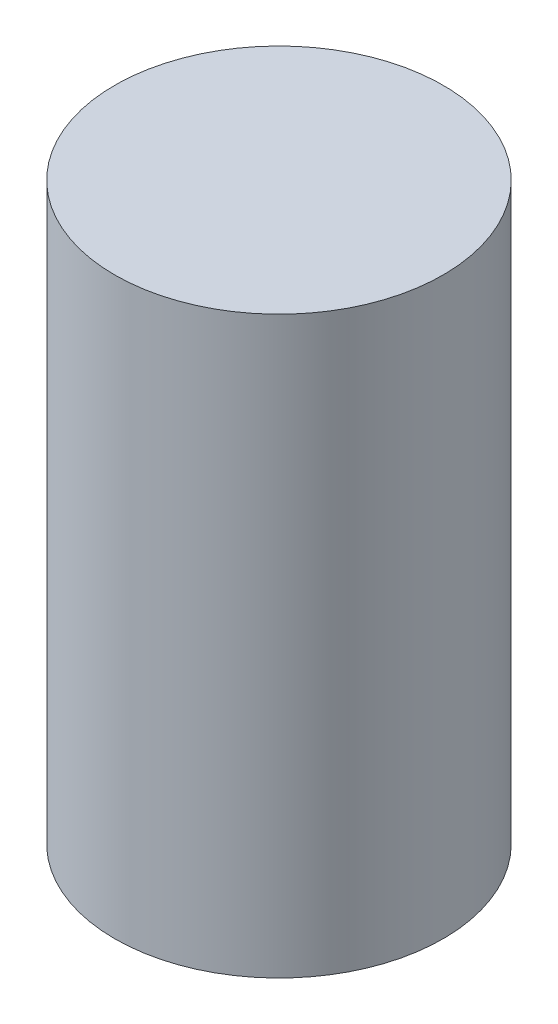
ISO-10303-21;
HEADER;
FILE_DESCRIPTION(('STEP AP214'),'2;1');
FILE_NAME('part.step','',(''),(''),'','','');
FILE_SCHEMA(('AUTOMOTIVE_DESIGN { 1 0 10303 214 1 1 1 1 }'));
ENDSEC;
DATA;
#1=APPLICATION_CONTEXT('core data for automotive mechanical design processes');
#2=APPLICATION_PROTOCOL_DEFINITION('international standard','automotive_design',2000,#1);
#3=PRODUCT_CONTEXT('',#1,'mechanical');
#4=PRODUCT('Part','Part','',(#3));
#5=PRODUCT_RELATED_PRODUCT_CATEGORY('part','',(#4));
#6=PRODUCT_DEFINITION_FORMATION('','',#4);
#7=PRODUCT_DEFINITION_CONTEXT('part definition',#1,'design');
#8=PRODUCT_DEFINITION('design','',#6,#7);
#9=PRODUCT_DEFINITION_SHAPE('','',#8);
#10=(LENGTH_UNIT() NAMED_UNIT(*) SI_UNIT(.MILLI.,.METRE.));
#11=(NAMED_UNIT(*) PLANE_ANGLE_UNIT() SI_UNIT($,.RADIAN.));
#12=(NAMED_UNIT(*) SI_UNIT($,.STERADIAN.) SOLID_ANGLE_UNIT());
#13=UNCERTAINTY_MEASURE_WITH_UNIT(LENGTH_MEASURE(1.E-05),#10,'distance_accuracy_value','');
#14=(GEOMETRIC_REPRESENTATION_CONTEXT(3) GLOBAL_UNCERTAINTY_ASSIGNED_CONTEXT((#13)) GLOBAL_UNIT_ASSIGNED_CONTEXT((#10,
#11,#12)) REPRESENTATION_CONTEXT('',''));
#15=CARTESIAN_POINT('',(0.,0.,0.));
#16=DIRECTION('',(0.,0.,1.));
#17=DIRECTION('',(1.,0.,0.));
#18=AXIS2_PLACEMENT_3D('',#15,#16,#17);
#19=CARTESIAN_POINT('',(-33.7559074660592,7.,-30.1569320376926));
#20=DIRECTION('',(0.,-1.,0.));
#21=DIRECTION('',(0.,0.,-1.));
#22=AXIS2_PLACEMENT_3D('',#19,#20,#21);
#23=CYLINDRICAL_SURFACE('',#22,2.);
#24=CARTESIAN_POINT('',(-33.7559074660592,7.,-30.1569320376926));
#25=DIRECTION('',(0.,1.,0.));
#26=DIRECTION('',(0.,0.,1.));
#27=AXIS2_PLACEMENT_3D('',#24,#25,#26);
#28=CIRCLE('',#27,2.);
#29=CARTESIAN_POINT('',(-33.7559074660592,7.,-28.1569320376926));
#30=VERTEX_POINT('',#29);
#31=EDGE_CURVE('E10',#30,#30,#28,.T.);
#32=ORIENTED_EDGE('',*,*,#31,.F.);
#33=EDGE_LOOP('',(#32));
#34=FACE_BOUND('',#33,.T.);
#35=CARTESIAN_POINT('',(-33.7559074660592,0.,-30.1569320376926));
#36=DIRECTION('',(0.,1.,0.));
#37=DIRECTION('',(0.,0.,1.));
#38=AXIS2_PLACEMENT_3D('',#35,#36,#37);
#39=CIRCLE('',#38,2.);
#40=CARTESIAN_POINT('',(-33.7559074660592,0.,-28.1569320376926));
#41=VERTEX_POINT('',#40);
#42=EDGE_CURVE('E44',#41,#41,#39,.T.);
#43=ORIENTED_EDGE('',*,*,#42,.T.);
#44=EDGE_LOOP('',(#43));
#45=FACE_BOUND('',#44,.T.);
#46=ADVANCED_FACE('F41',(#34,#45),#23,.T.);
#47=CARTESIAN_POINT('',(-33.7559074660592,7.,-30.1569320376926));
#48=DIRECTION('',(0.,1.,0.));
#49=DIRECTION('',(0.,0.,1.));
#50=AXIS2_PLACEMENT_3D('',#47,#48,#49);
#51=PLANE('',#50);
#52=ORIENTED_EDGE('',*,*,#31,.T.);
#53=EDGE_LOOP('',(#52));
#54=FACE_BOUND('',#53,.T.);
#55=ADVANCED_FACE('F58',(#54),#51,.T.);
#56=CARTESIAN_POINT('',(-33.7559074660592,0.,-30.1569320376926));
#57=DIRECTION('',(0.,1.,0.));
#58=DIRECTION('',(0.,0.,1.));
#59=AXIS2_PLACEMENT_3D('',#56,#57,#58);
#60=PLANE('',#59);
#61=ORIENTED_EDGE('',*,*,#42,.F.);
#62=EDGE_LOOP('',(#61));
#63=FACE_BOUND('',#62,.T.);
#64=ADVANCED_FACE('F56',(#63),#60,.F.);
#65=CLOSED_SHELL('',(#46,#55,#64));
#66=MANIFOLD_SOLID_BREP('B2',#65);
#67=ADVANCED_BREP_SHAPE_REPRESENTATION('',(#18,#66),#14);
#68=SHAPE_DEFINITION_REPRESENTATION(#9,#67);
ENDSEC;
END-ISO-10303-21;
